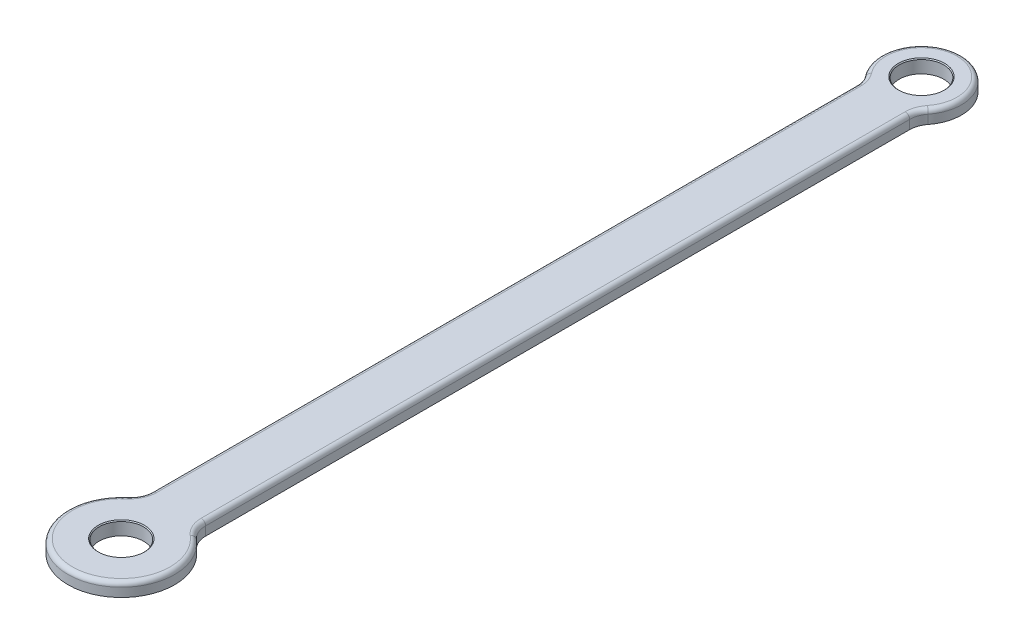
ISO-10303-21;
HEADER;
FILE_DESCRIPTION(('STEP AP214'),'2;1');
FILE_NAME('part.step','',(''),(''),'','','');
FILE_SCHEMA(('AUTOMOTIVE_DESIGN { 1 0 10303 214 1 1 1 1 }'));
ENDSEC;
DATA;
#1=APPLICATION_CONTEXT('core data for automotive mechanical design processes');
#2=APPLICATION_PROTOCOL_DEFINITION('international standard','automotive_design',2000,#1);
#3=PRODUCT_CONTEXT('',#1,'mechanical');
#4=PRODUCT('Part','Part','',(#3));
#5=PRODUCT_RELATED_PRODUCT_CATEGORY('part','',(#4));
#6=PRODUCT_DEFINITION_FORMATION('','',#4);
#7=PRODUCT_DEFINITION_CONTEXT('part definition',#1,'design');
#8=PRODUCT_DEFINITION('design','',#6,#7);
#9=PRODUCT_DEFINITION_SHAPE('','',#8);
#10=(LENGTH_UNIT() NAMED_UNIT(*) SI_UNIT(.MILLI.,.METRE.));
#11=(NAMED_UNIT(*) PLANE_ANGLE_UNIT() SI_UNIT($,.RADIAN.));
#12=(NAMED_UNIT(*) SI_UNIT($,.STERADIAN.) SOLID_ANGLE_UNIT());
#13=UNCERTAINTY_MEASURE_WITH_UNIT(LENGTH_MEASURE(1.E-05),#10,'distance_accuracy_value','');
#14=(GEOMETRIC_REPRESENTATION_CONTEXT(3) GLOBAL_UNCERTAINTY_ASSIGNED_CONTEXT((#13)) GLOBAL_UNIT_ASSIGNED_CONTEXT((#10,
#11,#12)) REPRESENTATION_CONTEXT('',''));
#15=CARTESIAN_POINT('',(0.,0.,0.));
#16=DIRECTION('',(0.,0.,1.));
#17=DIRECTION('',(1.,0.,0.));
#18=AXIS2_PLACEMENT_3D('',#15,#16,#17);
#19=CARTESIAN_POINT('',(0.,2.5,-31.9864213350138));
#20=DIRECTION('',(0.,1.,0.));
#21=DIRECTION('',(0.,0.,1.));
#22=AXIS2_PLACEMENT_3D('',#19,#20,#21);
#23=PLANE('',#22);
#24=CARTESIAN_POINT('',(0.,2.5,-31.9864213350138));
#25=DIRECTION('',(0.,1.,0.));
#26=DIRECTION('',(0.,0.,1.));
#27=AXIS2_PLACEMENT_3D('',#24,#25,#26);
#28=CIRCLE('',#27,8.);
#29=CARTESIAN_POINT('',(6.28571428571429,2.5,-27.0377047419598));
#30=VERTEX_POINT('',#29);
#31=CARTESIAN_POINT('',(-6.28571428571429,2.5,-27.0377047419598));
#32=VERTEX_POINT('',#31);
#33=EDGE_CURVE('E212',#30,#32,#28,.T.);
#34=ORIENTED_EDGE('',*,*,#33,.T.);
#35=CARTESIAN_POINT('',(-11.,2.5,-23.3261672971694));
#36=DIRECTION('',(0.,1.,0.));
#37=DIRECTION('',(0.,0.,1.));
#38=AXIS2_PLACEMENT_3D('',#35,#36,#37);
#39=CIRCLE('',#38,6.);
#40=CARTESIAN_POINT('',(-5.,2.5,-23.3261672971694));
#41=VERTEX_POINT('',#40);
#42=EDGE_CURVE('E214',#32,#41,#39,.F.);
#43=ORIENTED_EDGE('',*,*,#42,.T.);
#44=DIRECTION('',(0.,0.,1.));
#45=VECTOR('',#44,1.);
#46=CARTESIAN_POINT('',(-5.00000000000002,2.5,135.052097268171));
#47=LINE('',#46,#45);
#48=CARTESIAN_POINT('',(-5.00000000000002,2.5,135.052097268171));
#49=VERTEX_POINT('',#48);
#50=EDGE_CURVE('E200',#41,#49,#47,.T.);
#51=ORIENTED_EDGE('',*,*,#50,.T.);
#52=CARTESIAN_POINT('',(-11.,2.5,135.052097268171));
#53=DIRECTION('',(0.,1.,0.));
#54=DIRECTION('',(0.,0.,1.));
#55=AXIS2_PLACEMENT_3D('',#52,#53,#54);
#56=CIRCLE('',#55,6.);
#57=CARTESIAN_POINT('',(-7.11764705882354,2.5,139.626737761164));
#58=VERTEX_POINT('',#57);
#59=EDGE_CURVE('E202',#49,#58,#56,.F.);
#60=ORIENTED_EDGE('',*,*,#59,.T.);
#61=CARTESIAN_POINT('',(0.,2.5,148.013578664986));
#62=DIRECTION('',(0.,1.,0.));
#63=DIRECTION('',(0.,0.,1.));
#64=AXIS2_PLACEMENT_3D('',#61,#62,#63);
#65=CIRCLE('',#64,11.);
#66=CARTESIAN_POINT('',(7.11764705882354,2.5,139.626737761164));
#67=VERTEX_POINT('',#66);
#68=EDGE_CURVE('E204',#58,#67,#65,.T.);
#69=ORIENTED_EDGE('',*,*,#68,.T.);
#70=CARTESIAN_POINT('',(11.,2.5,135.052097268171));
#71=DIRECTION('',(0.,1.,0.));
#72=DIRECTION('',(0.,0.,1.));
#73=AXIS2_PLACEMENT_3D('',#70,#71,#72);
#74=CIRCLE('',#73,6.);
#75=CARTESIAN_POINT('',(5.00000000000002,2.5,135.052097268171));
#76=VERTEX_POINT('',#75);
#77=EDGE_CURVE('E206',#67,#76,#74,.F.);
#78=ORIENTED_EDGE('',*,*,#77,.T.);
#79=DIRECTION('',(0.,0.,-1.));
#80=VECTOR('',#79,1.);
#81=CARTESIAN_POINT('',(5.,2.5,-23.3261672971694));
#82=LINE('',#81,#80);
#83=CARTESIAN_POINT('',(5.,2.5,-23.3261672971694));
#84=VERTEX_POINT('',#83);
#85=EDGE_CURVE('E208',#76,#84,#82,.T.);
#86=ORIENTED_EDGE('',*,*,#85,.T.);
#87=CARTESIAN_POINT('',(11.,2.5,-23.3261672971694));
#88=DIRECTION('',(0.,1.,0.));
#89=DIRECTION('',(0.,0.,1.));
#90=AXIS2_PLACEMENT_3D('',#87,#88,#89);
#91=CIRCLE('',#90,6.);
#92=EDGE_CURVE('E210',#84,#30,#91,.F.);
#93=ORIENTED_EDGE('',*,*,#92,.T.);
#94=EDGE_LOOP('',(#34,#43,#51,#60,#69,#78,#86,#93));
#95=FACE_BOUND('',#94,.T.);
#96=CARTESIAN_POINT('',(0.,2.5,148.013578664986));
#97=DIRECTION('',(0.,1.,0.));
#98=DIRECTION('',(0.,0.,1.));
#99=AXIS2_PLACEMENT_3D('',#96,#97,#98);
#100=CIRCLE('',#99,5.20000000000001);
#101=CARTESIAN_POINT('',(0.,2.5,153.213578664986));
#102=VERTEX_POINT('',#101);
#103=EDGE_CURVE('E179',#102,#102,#100,.F.);
#104=ORIENTED_EDGE('',*,*,#103,.T.);
#105=EDGE_LOOP('',(#104));
#106=FACE_BOUND('',#105,.T.);
#107=CARTESIAN_POINT('',(0.,2.5,-31.9864213350138));
#108=DIRECTION('',(0.,1.,0.));
#109=DIRECTION('',(0.,0.,1.));
#110=AXIS2_PLACEMENT_3D('',#107,#108,#109);
#111=CIRCLE('',#110,5.20000000000001);
#112=CARTESIAN_POINT('',(0.,2.5,-26.7864213350137));
#113=VERTEX_POINT('',#112);
#114=EDGE_CURVE('E171',#113,#113,#111,.F.);
#115=ORIENTED_EDGE('',*,*,#114,.T.);
#116=EDGE_LOOP('',(#115));
#117=FACE_BOUND('',#116,.T.);
#118=ADVANCED_FACE('F47',(#95,#106,#117),#23,.T.);
#119=CARTESIAN_POINT('',(0.,-0.5,-31.9864213350138));
#120=DIRECTION('',(0.,1.,0.));
#121=DIRECTION('',(0.,0.,1.));
#122=AXIS2_PLACEMENT_3D('',#119,#120,#121);
#123=PLANE('',#122);
#124=CARTESIAN_POINT('',(0.,-0.5,-31.9864213350138));
#125=DIRECTION('',(0.,1.,0.));
#126=DIRECTION('',(0.,0.,1.));
#127=AXIS2_PLACEMENT_3D('',#124,#125,#126);
#128=CIRCLE('',#127,9.);
#129=CARTESIAN_POINT('',(7.07142857142857,-0.5,-26.4191151678281));
#130=VERTEX_POINT('',#129);
#131=CARTESIAN_POINT('',(-7.07142857142857,-0.5,-26.4191151678281));
#132=VERTEX_POINT('',#131);
#133=EDGE_CURVE('E260',#130,#132,#128,.T.);
#134=ORIENTED_EDGE('',*,*,#133,.F.);
#135=CARTESIAN_POINT('',(11.,-0.5,-23.3261672971694));
#136=DIRECTION('',(0.,1.,0.));
#137=DIRECTION('',(0.,0.,1.));
#138=AXIS2_PLACEMENT_3D('',#135,#136,#137);
#139=CIRCLE('',#138,5.);
#140=CARTESIAN_POINT('',(6.,-0.5,-23.3261672971694));
#141=VERTEX_POINT('',#140);
#142=EDGE_CURVE('E166',#130,#141,#139,.T.);
#143=ORIENTED_EDGE('',*,*,#142,.T.);
#144=DIRECTION('',(0.,0.,-1.));
#145=VECTOR('',#144,1.);
#146=CARTESIAN_POINT('',(6.,-0.5,-25.2782174025144));
#147=LINE('',#146,#145);
#148=CARTESIAN_POINT('',(6.00000000000002,-0.5,135.052097268171));
#149=VERTEX_POINT('',#148);
#150=EDGE_CURVE('E143',#149,#141,#147,.T.);
#151=ORIENTED_EDGE('',*,*,#150,.F.);
#152=CARTESIAN_POINT('',(11.,-0.5,135.052097268171));
#153=DIRECTION('',(0.,1.,0.));
#154=DIRECTION('',(0.,0.,1.));
#155=AXIS2_PLACEMENT_3D('',#152,#153,#154);
#156=CIRCLE('',#155,5.);
#157=CARTESIAN_POINT('',(7.76470588235296,-0.5,138.864297678999));
#158=VERTEX_POINT('',#157);
#159=EDGE_CURVE('E153',#149,#158,#156,.T.);
#160=ORIENTED_EDGE('',*,*,#159,.T.);
#161=CARTESIAN_POINT('',(0.,-0.5,148.013578664986));
#162=DIRECTION('',(0.,1.,0.));
#163=DIRECTION('',(0.,0.,1.));
#164=AXIS2_PLACEMENT_3D('',#161,#162,#163);
#165=CIRCLE('',#164,12.);
#166=CARTESIAN_POINT('',(-7.76470588235296,-0.5,138.864297678999));
#167=VERTEX_POINT('',#166);
#168=EDGE_CURVE('E168',#167,#158,#165,.T.);
#169=ORIENTED_EDGE('',*,*,#168,.F.);
#170=CARTESIAN_POINT('',(-11.,-0.5,135.052097268171));
#171=DIRECTION('',(0.,1.,0.));
#172=DIRECTION('',(0.,0.,1.));
#173=AXIS2_PLACEMENT_3D('',#170,#171,#172);
#174=CIRCLE('',#173,5.);
#175=CARTESIAN_POINT('',(-6.00000000000002,-0.5,135.052097268171));
#176=VERTEX_POINT('',#175);
#177=EDGE_CURVE('E159',#167,#176,#174,.T.);
#178=ORIENTED_EDGE('',*,*,#177,.T.);
#179=DIRECTION('',(0.,0.,1.));
#180=VECTOR('',#179,1.);
#181=CARTESIAN_POINT('',(-6.,-0.5,-25.2782174025144));
#182=LINE('',#181,#180);
#183=CARTESIAN_POINT('',(-6.,-0.5,-23.3261672971694));
#184=VERTEX_POINT('',#183);
#185=EDGE_CURVE('E173',#184,#176,#182,.T.);
#186=ORIENTED_EDGE('',*,*,#185,.F.);
#187=CARTESIAN_POINT('',(-11.,-0.5,-23.3261672971694));
#188=DIRECTION('',(0.,1.,0.));
#189=DIRECTION('',(0.,0.,1.));
#190=AXIS2_PLACEMENT_3D('',#187,#188,#189);
#191=CIRCLE('',#190,5.);
#192=EDGE_CURVE('E197',#184,#132,#191,.T.);
#193=ORIENTED_EDGE('',*,*,#192,.T.);
#194=EDGE_LOOP('',(#134,#143,#151,#160,#169,#178,#186,#193));
#195=FACE_BOUND('',#194,.T.);
#196=CARTESIAN_POINT('',(0.,-0.5,-31.9864213350138));
#197=DIRECTION('',(0.,1.,0.));
#198=DIRECTION('',(0.,0.,1.));
#199=AXIS2_PLACEMENT_3D('',#196,#197,#198);
#200=CIRCLE('',#199,5.);
#201=CARTESIAN_POINT('',(0.,-0.5,-26.9864213350138));
#202=VERTEX_POINT('',#201);
#203=EDGE_CURVE('E255',#202,#202,#200,.T.);
#204=ORIENTED_EDGE('',*,*,#203,.T.);
#205=EDGE_LOOP('',(#204));
#206=FACE_BOUND('',#205,.T.);
#207=CARTESIAN_POINT('',(0.,-0.5,148.013578664986));
#208=DIRECTION('',(0.,1.,0.));
#209=DIRECTION('',(0.,0.,1.));
#210=AXIS2_PLACEMENT_3D('',#207,#208,#209);
#211=CIRCLE('',#210,5.);
#212=CARTESIAN_POINT('',(0.,-0.5,153.013578664986));
#213=VERTEX_POINT('',#212);
#214=EDGE_CURVE('E250',#213,#213,#211,.T.);
#215=ORIENTED_EDGE('',*,*,#214,.T.);
#216=EDGE_LOOP('',(#215));
#217=FACE_BOUND('',#216,.T.);
#218=ADVANCED_FACE('F163',(#195,#206,#217),#123,.F.);
#219=CARTESIAN_POINT('',(0.,2.5,-31.9864213350138));
#220=DIRECTION('',(0.,-1.,0.));
#221=DIRECTION('',(0.,0.,-1.));
#222=AXIS2_PLACEMENT_3D('',#219,#220,#221);
#223=CYLINDRICAL_SURFACE('',#222,9.);
#224=DIRECTION('',(0.,-1.,0.));
#225=VECTOR('',#224,1.);
#226=CARTESIAN_POINT('',(-7.07142857142857,2.5,-26.4191151678281));
#227=LINE('',#226,#225);
#228=CARTESIAN_POINT('',(-7.07142857142857,1.5,-26.4191151678281));
#229=VERTEX_POINT('',#228);
#230=EDGE_CURVE('E160',#132,#229,#227,.F.);
#231=ORIENTED_EDGE('',*,*,#230,.T.);
#232=CARTESIAN_POINT('',(0.,1.5,-31.9864213350138));
#233=DIRECTION('',(0.,1.,0.));
#234=DIRECTION('',(0.,0.,1.));
#235=AXIS2_PLACEMENT_3D('',#232,#233,#234);
#236=CIRCLE('',#235,9.);
#237=CARTESIAN_POINT('',(7.07142857142857,1.5,-26.4191151678281));
#238=VERTEX_POINT('',#237);
#239=EDGE_CURVE('E220',#229,#238,#236,.F.);
#240=ORIENTED_EDGE('',*,*,#239,.T.);
#241=DIRECTION('',(0.,-1.,0.));
#242=VECTOR('',#241,1.);
#243=CARTESIAN_POINT('',(7.07142857142857,2.5,-26.4191151678281));
#244=LINE('',#243,#242);
#245=EDGE_CURVE('E192',#238,#130,#244,.T.);
#246=ORIENTED_EDGE('',*,*,#245,.T.);
#247=ORIENTED_EDGE('',*,*,#133,.T.);
#248=EDGE_LOOP('',(#231,#240,#246,#247));
#249=FACE_BOUND('',#248,.T.);
#250=ADVANCED_FACE('F301',(#249),#223,.T.);
#251=CARTESIAN_POINT('',(-6.,2.5,-25.2782174025144));
#252=DIRECTION('',(1.,0.,0.));
#253=DIRECTION('',(0.,0.,-1.));
#254=AXIS2_PLACEMENT_3D('',#251,#252,#253);
#255=PLANE('',#254);
#256=DIRECTION('',(0.,1.,0.));
#257=VECTOR('',#256,1.);
#258=CARTESIAN_POINT('',(-6.00000000000002,2.5,135.052097268171));
#259=LINE('',#258,#257);
#260=CARTESIAN_POINT('',(-6.00000000000002,1.5,135.052097268171));
#261=VERTEX_POINT('',#260);
#262=EDGE_CURVE('E190',#176,#261,#259,.T.);
#263=ORIENTED_EDGE('',*,*,#262,.T.);
#264=DIRECTION('',(0.,0.,1.));
#265=VECTOR('',#264,1.);
#266=CARTESIAN_POINT('',(-6.,1.5,-23.3261672971694));
#267=LINE('',#266,#265);
#268=CARTESIAN_POINT('',(-6.,1.5,-23.3261672971694));
#269=VERTEX_POINT('',#268);
#270=EDGE_CURVE('E12',#261,#269,#267,.F.);
#271=ORIENTED_EDGE('',*,*,#270,.T.);
#272=DIRECTION('',(0.,1.,0.));
#273=VECTOR('',#272,1.);
#274=CARTESIAN_POINT('',(-6.,-0.5,-23.3261672971694));
#275=LINE('',#274,#273);
#276=EDGE_CURVE('E188',#269,#184,#275,.F.);
#277=ORIENTED_EDGE('',*,*,#276,.T.);
#278=ORIENTED_EDGE('',*,*,#185,.T.);
#279=EDGE_LOOP('',(#263,#271,#277,#278));
#280=FACE_BOUND('',#279,.T.);
#281=ADVANCED_FACE('F267',(#280),#255,.F.);
#282=CARTESIAN_POINT('',(0.,2.5,148.013578664986));
#283=DIRECTION('',(0.,-1.,0.));
#284=DIRECTION('',(0.,0.,-1.));
#285=AXIS2_PLACEMENT_3D('',#282,#283,#284);
#286=CYLINDRICAL_SURFACE('',#285,12.);
#287=DIRECTION('',(0.,-1.,0.));
#288=VECTOR('',#287,1.);
#289=CARTESIAN_POINT('',(7.76470588235296,2.5,138.864297678999));
#290=LINE('',#289,#288);
#291=CARTESIAN_POINT('',(7.76470588235296,1.5,138.864297678999));
#292=VERTEX_POINT('',#291);
#293=EDGE_CURVE('E155',#158,#292,#290,.F.);
#294=ORIENTED_EDGE('',*,*,#293,.T.);
#295=CARTESIAN_POINT('',(0.,1.5,148.013578664986));
#296=DIRECTION('',(0.,1.,0.));
#297=DIRECTION('',(0.,0.,1.));
#298=AXIS2_PLACEMENT_3D('',#295,#296,#297);
#299=CIRCLE('',#298,12.);
#300=CARTESIAN_POINT('',(-7.76470588235296,1.5,138.864297678999));
#301=VERTEX_POINT('',#300);
#302=EDGE_CURVE('E71',#292,#301,#299,.F.);
#303=ORIENTED_EDGE('',*,*,#302,.T.);
#304=DIRECTION('',(0.,-1.,0.));
#305=VECTOR('',#304,1.);
#306=CARTESIAN_POINT('',(-7.76470588235296,2.5,138.864297678999));
#307=LINE('',#306,#305);
#308=EDGE_CURVE('E149',#301,#167,#307,.T.);
#309=ORIENTED_EDGE('',*,*,#308,.T.);
#310=ORIENTED_EDGE('',*,*,#168,.T.);
#311=EDGE_LOOP('',(#294,#303,#309,#310));
#312=FACE_BOUND('',#311,.T.);
#313=ADVANCED_FACE('F274',(#312),#286,.T.);
#314=CARTESIAN_POINT('',(6.,2.5,-25.2782174025144));
#315=DIRECTION('',(-1.,0.,0.));
#316=DIRECTION('',(0.,0.,1.));
#317=AXIS2_PLACEMENT_3D('',#314,#315,#316);
#318=PLANE('',#317);
#319=DIRECTION('',(0.,1.,0.));
#320=VECTOR('',#319,1.);
#321=CARTESIAN_POINT('',(6.,2.5,-23.3261672971694));
#322=LINE('',#321,#320);
#323=CARTESIAN_POINT('',(6.,1.5,-23.3261672971694));
#324=VERTEX_POINT('',#323);
#325=EDGE_CURVE('E150',#141,#324,#322,.T.);
#326=ORIENTED_EDGE('',*,*,#325,.T.);
#327=DIRECTION('',(0.,0.,-1.));
#328=VECTOR('',#327,1.);
#329=CARTESIAN_POINT('',(6.00000000000002,1.5,135.052097268171));
#330=LINE('',#329,#328);
#331=CARTESIAN_POINT('',(6.00000000000002,1.5,135.052097268171));
#332=VERTEX_POINT('',#331);
#333=EDGE_CURVE('E146',#324,#332,#330,.F.);
#334=ORIENTED_EDGE('',*,*,#333,.T.);
#335=DIRECTION('',(0.,1.,0.));
#336=VECTOR('',#335,1.);
#337=CARTESIAN_POINT('',(6.00000000000002,-0.5,135.052097268171));
#338=LINE('',#337,#336);
#339=EDGE_CURVE('E138',#332,#149,#338,.F.);
#340=ORIENTED_EDGE('',*,*,#339,.T.);
#341=ORIENTED_EDGE('',*,*,#150,.T.);
#342=EDGE_LOOP('',(#326,#334,#340,#341));
#343=FACE_BOUND('',#342,.T.);
#344=ADVANCED_FACE('F141',(#343),#318,.F.);
#345=CARTESIAN_POINT('',(0.,2.5,-31.9864213350138));
#346=DIRECTION('',(0.,-1.,0.));
#347=DIRECTION('',(0.,0.,-1.));
#348=AXIS2_PLACEMENT_3D('',#345,#346,#347);
#349=CYLINDRICAL_SURFACE('',#348,5.);
#350=CARTESIAN_POINT('',(0.,2.29999999999999,-31.9864213350138));
#351=DIRECTION('',(0.,1.,0.));
#352=DIRECTION('',(0.,0.,1.));
#353=AXIS2_PLACEMENT_3D('',#350,#351,#352);
#354=CIRCLE('',#353,5.);
#355=CARTESIAN_POINT('',(0.,2.29999999999999,-26.9864213350138));
#356=VERTEX_POINT('',#355);
#357=EDGE_CURVE('E182',#356,#356,#354,.T.);
#358=ORIENTED_EDGE('',*,*,#357,.T.);
#359=EDGE_LOOP('',(#358));
#360=FACE_BOUND('',#359,.T.);
#361=ORIENTED_EDGE('',*,*,#203,.F.);
#362=EDGE_LOOP('',(#361));
#363=FACE_BOUND('',#362,.T.);
#364=ADVANCED_FACE('F325',(#360,#363),#349,.F.);
#365=CARTESIAN_POINT('',(0.,2.5,148.013578664986));
#366=DIRECTION('',(0.,-1.,0.));
#367=DIRECTION('',(0.,0.,-1.));
#368=AXIS2_PLACEMENT_3D('',#365,#366,#367);
#369=CYLINDRICAL_SURFACE('',#368,5.);
#370=CARTESIAN_POINT('',(0.,2.29999999999999,148.013578664986));
#371=DIRECTION('',(0.,1.,0.));
#372=DIRECTION('',(0.,0.,1.));
#373=AXIS2_PLACEMENT_3D('',#370,#371,#372);
#374=CIRCLE('',#373,5.);
#375=CARTESIAN_POINT('',(0.,2.29999999999999,153.013578664986));
#376=VERTEX_POINT('',#375);
#377=EDGE_CURVE('E167',#376,#376,#374,.T.);
#378=ORIENTED_EDGE('',*,*,#377,.T.);
#379=EDGE_LOOP('',(#378));
#380=FACE_BOUND('',#379,.T.);
#381=ORIENTED_EDGE('',*,*,#214,.F.);
#382=EDGE_LOOP('',(#381));
#383=FACE_BOUND('',#382,.T.);
#384=ADVANCED_FACE('F328',(#380,#383),#369,.F.);
#385=CARTESIAN_POINT('',(0.,2.29999999999999,148.013578664986));
#386=DIRECTION('',(0.,1.,0.));
#387=DIRECTION('',(0.,0.,1.));
#388=AXIS2_PLACEMENT_3D('',#385,#386,#387);
#389=CONICAL_SURFACE('',#388,5.,0.78539816339745);
#390=CARTESIAN_POINT('',(0.,2.5,153.213578664986));
#391=CARTESIAN_POINT('',(0.,2.49791666666667,153.211495331653));
#392=CARTESIAN_POINT('',(0.,2.49583333333334,153.20941199832));
#393=CARTESIAN_POINT('',(0.,2.49166666666667,153.205245331653));
#394=CARTESIAN_POINT('',(0.,2.48958333333333,153.20316199832));
#395=CARTESIAN_POINT('',(0.,2.48541666666666,153.198995331653));
#396=CARTESIAN_POINT('',(0.,2.48333333333333,153.19691199832));
#397=CARTESIAN_POINT('',(0.,2.47916666666667,153.192745331653));
#398=CARTESIAN_POINT('',(0.,2.47708333333333,153.19066199832));
#399=CARTESIAN_POINT('',(0.,2.47291666666666,153.186495331653));
#400=CARTESIAN_POINT('',(0.,2.47083333333333,153.18441199832));
#401=CARTESIAN_POINT('',(0.,2.46666666666667,153.180245331653));
#402=CARTESIAN_POINT('',(0.,2.46458333333333,153.17816199832));
#403=CARTESIAN_POINT('',(0.,2.46041666666666,153.173995331653));
#404=CARTESIAN_POINT('',(0.,2.45833333333333,153.17191199832));
#405=CARTESIAN_POINT('',(0.,2.45416666666667,153.167745331653));
#406=CARTESIAN_POINT('',(0.,2.45208333333333,153.16566199832));
#407=CARTESIAN_POINT('',(0.,2.44791666666666,153.161495331653));
#408=CARTESIAN_POINT('',(0.,2.44583333333333,153.15941199832));
#409=CARTESIAN_POINT('',(0.,2.44166666666667,153.155245331653));
#410=CARTESIAN_POINT('',(0.,2.43958333333333,153.15316199832));
#411=CARTESIAN_POINT('',(0.,2.43541666666666,153.148995331653));
#412=CARTESIAN_POINT('',(0.,2.43333333333333,153.14691199832));
#413=CARTESIAN_POINT('',(0.,2.42916666666666,153.142745331653));
#414=CARTESIAN_POINT('',(0.,2.42708333333333,153.14066199832));
#415=CARTESIAN_POINT('',(0.,2.42291666666666,153.136495331653));
#416=CARTESIAN_POINT('',(0.,2.42083333333333,153.13441199832));
#417=CARTESIAN_POINT('',(0.,2.41666666666666,153.130245331653));
#418=CARTESIAN_POINT('',(0.,2.41458333333333,153.12816199832));
#419=CARTESIAN_POINT('',(0.,2.41041666666666,153.123995331653));
#420=CARTESIAN_POINT('',(0.,2.40833333333333,153.12191199832));
#421=CARTESIAN_POINT('',(0.,2.40416666666666,153.117745331653));
#422=CARTESIAN_POINT('',(0.,2.40208333333333,153.11566199832));
#423=CARTESIAN_POINT('',(0.,2.39791666666666,153.111495331653));
#424=CARTESIAN_POINT('',(0.,2.39583333333333,153.10941199832));
#425=CARTESIAN_POINT('',(0.,2.39166666666666,153.105245331653));
#426=CARTESIAN_POINT('',(0.,2.38958333333333,153.10316199832));
#427=CARTESIAN_POINT('',(0.,2.38541666666666,153.098995331653));
#428=CARTESIAN_POINT('',(0.,2.38333333333332,153.09691199832));
#429=CARTESIAN_POINT('',(0.,2.37916666666666,153.092745331653));
#430=CARTESIAN_POINT('',(0.,2.37708333333333,153.09066199832));
#431=CARTESIAN_POINT('',(0.,2.37291666666666,153.086495331653));
#432=CARTESIAN_POINT('',(0.,2.37083333333332,153.08441199832));
#433=CARTESIAN_POINT('',(0.,2.36666666666666,153.080245331653));
#434=CARTESIAN_POINT('',(0.,2.36458333333333,153.07816199832));
#435=CARTESIAN_POINT('',(0.,2.36041666666666,153.073995331653));
#436=CARTESIAN_POINT('',(0.,2.35833333333332,153.07191199832));
#437=CARTESIAN_POINT('',(0.,2.35416666666666,153.067745331653));
#438=CARTESIAN_POINT('',(0.,2.35208333333333,153.06566199832));
#439=CARTESIAN_POINT('',(0.,2.34791666666666,153.061495331653));
#440=CARTESIAN_POINT('',(0.,2.34583333333332,153.05941199832));
#441=CARTESIAN_POINT('',(0.,2.34166666666665,153.055245331653));
#442=CARTESIAN_POINT('',(0.,2.33958333333332,153.05316199832));
#443=CARTESIAN_POINT('',(0.,2.33541666666666,153.048995331653));
#444=CARTESIAN_POINT('',(0.,2.33333333333333,153.04691199832));
#445=CARTESIAN_POINT('',(0.,2.32916666666666,153.042745331653));
#446=CARTESIAN_POINT('',(0.,2.32708333333332,153.04066199832));
#447=CARTESIAN_POINT('',(0.,2.32291666666665,153.036495331653));
#448=CARTESIAN_POINT('',(0.,2.32083333333333,153.03441199832));
#449=CARTESIAN_POINT('',(0.,2.31666666666666,153.030245331653));
#450=CARTESIAN_POINT('',(0.,2.31458333333332,153.02816199832));
#451=CARTESIAN_POINT('',(0.,2.31041666666665,153.023995331653));
#452=CARTESIAN_POINT('',(0.,2.30833333333332,153.02191199832));
#453=CARTESIAN_POINT('',(0.,2.30416666666666,153.017745331653));
#454=CARTESIAN_POINT('',(0.,2.30208333333333,153.01566199832));
#455=CARTESIAN_POINT('',(0.,2.29999999999999,153.013578664986));
#456=B_SPLINE_CURVE_WITH_KNOTS('',3,(#390,#391,#392,#393,#394,#395,#396,#397,#398,#399,#400,
#401,#402,#403,#404,#405,#406,#407,#408,#409,#410,#411,#412,#413,#414,#415,#416,#417,#418,#419,
#420,#421,#422,#423,#424,#425,#426,#427,#428,#429,#430,#431,#432,#433,#434,#435,#436,#437,#438,
#439,#440,#441,#442,#443,#444,#445,#446,#447,#448,#449,#450,#451,#452,#453,#454,#455),
.UNSPECIFIED.,.F.,.F.,(4,2,2,2,2,2,2,2,2,2,2,2,2,2,2,2,2,2,2,2,2,2,2,2,2,2,2,2,2,2,2,2,4),(0.,
0.0088388347648413,0.017677669529663,0.0265165042945046,0.0353553390593262,0.0441941738241675,
0.0530330085889892,0.0618718433538308,0.0707106781186525,0.0795495128834938,0.0883883476483158,
0.0972271824131571,0.106066017177979,0.11490485194282,0.123743686707662,0.132582521472483,
0.141421356237325,0.150260191002147,0.159099025766988,0.16793786053181,0.176776695296651,
0.185615530061473,0.194454364826314,0.203293199591136,0.212132034355977,0.220970869120799,
0.229809703885641,0.238648538650482,0.247487373415304,0.256326208180145,0.265165042944967,
0.274003877709808,0.28284271247463),.UNSPECIFIED.);
#457=EDGE_CURVE('BSEAM321',#102,#376,#456,.T.);
#458=ORIENTED_EDGE('',*,*,#103,.F.);
#459=ORIENTED_EDGE('',*,*,#377,.F.);
#460=ORIENTED_EDGE('',*,*,#457,.T.);
#461=ORIENTED_EDGE('',*,*,#457,.F.);
#462=EDGE_LOOP('',(#458,#460,#459,#461));
#463=FACE_BOUND('',#462,.T.);
#464=ADVANCED_FACE('F321',(#463),#389,.F.);
#465=CARTESIAN_POINT('',(0.,2.29999999999999,-31.9864213350138));
#466=DIRECTION('',(0.,1.,0.));
#467=DIRECTION('',(0.,0.,1.));
#468=AXIS2_PLACEMENT_3D('',#465,#466,#467);
#469=CONICAL_SURFACE('',#468,5.,0.78539816339745);
#470=ORIENTED_EDGE('',*,*,#114,.F.);
#471=EDGE_LOOP('',(#470));
#472=FACE_BOUND('',#471,.T.);
#473=ORIENTED_EDGE('',*,*,#357,.F.);
#474=EDGE_LOOP('',(#473));
#475=FACE_BOUND('',#474,.T.);
#476=ADVANCED_FACE('F318',(#472,#475),#469,.F.);
#477=CARTESIAN_POINT('',(11.,2.5,135.052097268171));
#478=DIRECTION('',(0.,-1.,0.));
#479=DIRECTION('',(0.,0.,-1.));
#480=AXIS2_PLACEMENT_3D('',#477,#478,#479);
#481=CYLINDRICAL_SURFACE('',#480,5.);
#482=ORIENTED_EDGE('',*,*,#339,.F.);
#483=CARTESIAN_POINT('',(11.,1.5,135.052097268171));
#484=DIRECTION('',(0.,1.,0.));
#485=DIRECTION('',(0.,0.,1.));
#486=AXIS2_PLACEMENT_3D('',#483,#484,#485);
#487=CIRCLE('',#486,5.);
#488=EDGE_CURVE('E225',#332,#292,#487,.T.);
#489=ORIENTED_EDGE('',*,*,#488,.T.);
#490=ORIENTED_EDGE('',*,*,#293,.F.);
#491=ORIENTED_EDGE('',*,*,#159,.F.);
#492=EDGE_LOOP('',(#482,#489,#490,#491));
#493=FACE_BOUND('',#492,.T.);
#494=ADVANCED_FACE('F154',(#493),#481,.F.);
#495=CARTESIAN_POINT('',(-11.,2.5,135.052097268171));
#496=DIRECTION('',(0.,-1.,0.));
#497=DIRECTION('',(0.,0.,-1.));
#498=AXIS2_PLACEMENT_3D('',#495,#496,#497);
#499=CYLINDRICAL_SURFACE('',#498,5.);
#500=ORIENTED_EDGE('',*,*,#308,.F.);
#501=CARTESIAN_POINT('',(-11.,1.5,135.052097268171));
#502=DIRECTION('',(0.,1.,0.));
#503=DIRECTION('',(0.,0.,1.));
#504=AXIS2_PLACEMENT_3D('',#501,#502,#503);
#505=CIRCLE('',#504,5.);
#506=EDGE_CURVE('E56',#301,#261,#505,.T.);
#507=ORIENTED_EDGE('',*,*,#506,.T.);
#508=ORIENTED_EDGE('',*,*,#262,.F.);
#509=ORIENTED_EDGE('',*,*,#177,.F.);
#510=EDGE_LOOP('',(#500,#507,#508,#509));
#511=FACE_BOUND('',#510,.T.);
#512=ADVANCED_FACE('F272',(#511),#499,.F.);
#513=CARTESIAN_POINT('',(-11.,2.5,-23.3261672971694));
#514=DIRECTION('',(0.,-1.,0.));
#515=DIRECTION('',(0.,0.,-1.));
#516=AXIS2_PLACEMENT_3D('',#513,#514,#515);
#517=CYLINDRICAL_SURFACE('',#516,5.);
#518=ORIENTED_EDGE('',*,*,#276,.F.);
#519=CARTESIAN_POINT('',(-11.,1.5,-23.3261672971694));
#520=DIRECTION('',(0.,1.,0.));
#521=DIRECTION('',(0.,0.,1.));
#522=AXIS2_PLACEMENT_3D('',#519,#520,#521);
#523=CIRCLE('',#522,5.);
#524=EDGE_CURVE('E217',#269,#229,#523,.T.);
#525=ORIENTED_EDGE('',*,*,#524,.T.);
#526=ORIENTED_EDGE('',*,*,#230,.F.);
#527=ORIENTED_EDGE('',*,*,#192,.F.);
#528=EDGE_LOOP('',(#518,#525,#526,#527));
#529=FACE_BOUND('',#528,.T.);
#530=ADVANCED_FACE('F288',(#529),#517,.F.);
#531=CARTESIAN_POINT('',(11.,2.5,-23.3261672971694));
#532=DIRECTION('',(0.,-1.,0.));
#533=DIRECTION('',(0.,0.,-1.));
#534=AXIS2_PLACEMENT_3D('',#531,#532,#533);
#535=CYLINDRICAL_SURFACE('',#534,5.);
#536=ORIENTED_EDGE('',*,*,#245,.F.);
#537=CARTESIAN_POINT('',(11.,1.5,-23.3261672971694));
#538=DIRECTION('',(0.,1.,0.));
#539=DIRECTION('',(0.,0.,1.));
#540=AXIS2_PLACEMENT_3D('',#537,#538,#539);
#541=CIRCLE('',#540,5.);
#542=EDGE_CURVE('E222',#238,#324,#541,.T.);
#543=ORIENTED_EDGE('',*,*,#542,.T.);
#544=ORIENTED_EDGE('',*,*,#325,.F.);
#545=ORIENTED_EDGE('',*,*,#142,.F.);
#546=EDGE_LOOP('',(#536,#543,#544,#545));
#547=FACE_BOUND('',#546,.T.);
#548=ADVANCED_FACE('F304',(#547),#535,.F.);
#549=CARTESIAN_POINT('',(11.,1.5,135.052097268171));
#550=DIRECTION('',(0.,1.,0.));
#551=DIRECTION('',(0.,0.,1.));
#552=AXIS2_PLACEMENT_3D('',#549,#550,#551);
#553=TOROIDAL_SURFACE('',#552,6.,1.);
#554=CARTESIAN_POINT('',(7.11764705882353,1.5,139.626737761164));
#555=DIRECTION('',(0.762440082165632,0.,0.647058823529409));
#556=DIRECTION('',(0.64705882352941,0.,-0.762440082165633));
#557=AXIS2_PLACEMENT_3D('',#554,#555,#556);
#558=CIRCLE('',#557,1.);
#559=EDGE_CURVE('E244',#292,#67,#558,.T.);
#560=ORIENTED_EDGE('',*,*,#559,.F.);
#561=ORIENTED_EDGE('',*,*,#488,.F.);
#562=CARTESIAN_POINT('',(5.00000000000002,1.5,135.052097268171));
#563=DIRECTION('',(0.,0.,-1.));
#564=DIRECTION('',(-1.,0.,0.));
#565=AXIS2_PLACEMENT_3D('',#562,#563,#564);
#566=CIRCLE('',#565,1.);
#567=EDGE_CURVE('E51',#76,#332,#566,.T.);
#568=ORIENTED_EDGE('',*,*,#567,.F.);
#569=ORIENTED_EDGE('',*,*,#77,.F.);
#570=EDGE_LOOP('',(#560,#561,#568,#569));
#571=FACE_BOUND('',#570,.T.);
#572=ADVANCED_FACE('F49',(#571),#553,.T.);
#573=CARTESIAN_POINT('',(5.,1.5,-31.9864213350138));
#574=DIRECTION('',(0.,0.,1.));
#575=DIRECTION('',(1.,0.,0.));
#576=AXIS2_PLACEMENT_3D('',#573,#574,#575);
#577=CYLINDRICAL_SURFACE('',#576,1.);
#578=ORIENTED_EDGE('',*,*,#567,.T.);
#579=ORIENTED_EDGE('',*,*,#333,.F.);
#580=CARTESIAN_POINT('',(5.,1.5,-23.3261672971694));
#581=DIRECTION('',(0.,0.,-1.));
#582=DIRECTION('',(-1.,0.,0.));
#583=AXIS2_PLACEMENT_3D('',#580,#581,#582);
#584=CIRCLE('',#583,1.);
#585=EDGE_CURVE('E242',#84,#324,#584,.T.);
#586=ORIENTED_EDGE('',*,*,#585,.F.);
#587=ORIENTED_EDGE('',*,*,#85,.F.);
#588=EDGE_LOOP('',(#578,#579,#586,#587));
#589=FACE_BOUND('',#588,.T.);
#590=ADVANCED_FACE('F309',(#589),#577,.T.);
#591=CARTESIAN_POINT('',(0.,1.5,148.013578664986));
#592=DIRECTION('',(0.,1.,0.));
#593=DIRECTION('',(0.,0.,1.));
#594=AXIS2_PLACEMENT_3D('',#591,#592,#593);
#595=TOROIDAL_SURFACE('',#594,11.,1.);
#596=ORIENTED_EDGE('',*,*,#559,.T.);
#597=ORIENTED_EDGE('',*,*,#68,.F.);
#598=CARTESIAN_POINT('',(-7.11764705882354,1.5,139.626737761164));
#599=DIRECTION('',(0.762440082165633,0.,-0.647058823529408));
#600=DIRECTION('',(-0.647058823529408,0.,-0.762440082165634));
#601=AXIS2_PLACEMENT_3D('',#598,#599,#600);
#602=CIRCLE('',#601,1.);
#603=EDGE_CURVE('E239',#301,#58,#602,.T.);
#604=ORIENTED_EDGE('',*,*,#603,.F.);
#605=ORIENTED_EDGE('',*,*,#302,.F.);
#606=EDGE_LOOP('',(#596,#597,#604,#605));
#607=FACE_BOUND('',#606,.T.);
#608=ADVANCED_FACE('F277',(#607),#595,.T.);
#609=CARTESIAN_POINT('',(11.,1.5,-23.3261672971694));
#610=DIRECTION('',(0.,1.,0.));
#611=DIRECTION('',(0.,0.,1.));
#612=AXIS2_PLACEMENT_3D('',#609,#610,#611);
#613=TOROIDAL_SURFACE('',#612,6.,1.);
#614=ORIENTED_EDGE('',*,*,#585,.T.);
#615=ORIENTED_EDGE('',*,*,#542,.F.);
#616=CARTESIAN_POINT('',(6.28571428571429,1.5,-27.0377047419598));
#617=DIRECTION('',(0.618589574131741,0.,-0.785714285714286));
#618=DIRECTION('',(-0.785714285714286,0.,-0.618589574131741));
#619=AXIS2_PLACEMENT_3D('',#616,#617,#618);
#620=CIRCLE('',#619,1.);
#621=EDGE_CURVE('E236',#30,#238,#620,.T.);
#622=ORIENTED_EDGE('',*,*,#621,.F.);
#623=ORIENTED_EDGE('',*,*,#92,.F.);
#624=EDGE_LOOP('',(#614,#615,#622,#623));
#625=FACE_BOUND('',#624,.T.);
#626=ADVANCED_FACE('F306',(#625),#613,.T.);
#627=CARTESIAN_POINT('',(-11.,1.5,135.052097268171));
#628=DIRECTION('',(0.,1.,0.));
#629=DIRECTION('',(0.,0.,1.));
#630=AXIS2_PLACEMENT_3D('',#627,#628,#629);
#631=TOROIDAL_SURFACE('',#630,6.,1.);
#632=ORIENTED_EDGE('',*,*,#603,.T.);
#633=ORIENTED_EDGE('',*,*,#59,.F.);
#634=CARTESIAN_POINT('',(-5.00000000000002,1.5,135.052097268171));
#635=DIRECTION('',(0.,0.,-1.));
#636=DIRECTION('',(-1.,0.,0.));
#637=AXIS2_PLACEMENT_3D('',#634,#635,#636);
#638=CIRCLE('',#637,1.);
#639=EDGE_CURVE('E233',#261,#49,#638,.T.);
#640=ORIENTED_EDGE('',*,*,#639,.F.);
#641=ORIENTED_EDGE('',*,*,#506,.F.);
#642=EDGE_LOOP('',(#632,#633,#640,#641));
#643=FACE_BOUND('',#642,.T.);
#644=ADVANCED_FACE('F280',(#643),#631,.T.);
#645=CARTESIAN_POINT('',(0.,1.5,-31.9864213350138));
#646=DIRECTION('',(0.,1.,0.));
#647=DIRECTION('',(0.,0.,1.));
#648=AXIS2_PLACEMENT_3D('',#645,#646,#647);
#649=TOROIDAL_SURFACE('',#648,8.,1.);
#650=ORIENTED_EDGE('',*,*,#621,.T.);
#651=ORIENTED_EDGE('',*,*,#239,.F.);
#652=CARTESIAN_POINT('',(-6.28571428571429,1.5,-27.0377047419598));
#653=DIRECTION('',(0.618589574131743,0.,0.785714285714285));
#654=DIRECTION('',(0.785714285714285,0.,-0.618589574131743));
#655=AXIS2_PLACEMENT_3D('',#652,#653,#654);
#656=CIRCLE('',#655,1.);
#657=EDGE_CURVE('E231',#32,#229,#656,.T.);
#658=ORIENTED_EDGE('',*,*,#657,.F.);
#659=ORIENTED_EDGE('',*,*,#33,.F.);
#660=EDGE_LOOP('',(#650,#651,#658,#659));
#661=FACE_BOUND('',#660,.T.);
#662=ADVANCED_FACE('F297',(#661),#649,.T.);
#663=CARTESIAN_POINT('',(-5.,1.5,-31.9864213350138));
#664=DIRECTION('',(0.,0.,-1.));
#665=DIRECTION('',(-1.,0.,0.));
#666=AXIS2_PLACEMENT_3D('',#663,#664,#665);
#667=CYLINDRICAL_SURFACE('',#666,1.);
#668=ORIENTED_EDGE('',*,*,#639,.T.);
#669=ORIENTED_EDGE('',*,*,#50,.F.);
#670=CARTESIAN_POINT('',(-5.,1.5,-23.3261672971694));
#671=DIRECTION('',(0.,0.,-1.));
#672=DIRECTION('',(-1.,0.,0.));
#673=AXIS2_PLACEMENT_3D('',#670,#671,#672);
#674=CIRCLE('',#673,1.);
#675=EDGE_CURVE('E229',#269,#41,#674,.T.);
#676=ORIENTED_EDGE('',*,*,#675,.F.);
#677=ORIENTED_EDGE('',*,*,#270,.F.);
#678=EDGE_LOOP('',(#668,#669,#676,#677));
#679=FACE_BOUND('',#678,.T.);
#680=ADVANCED_FACE('F285',(#679),#667,.T.);
#681=CARTESIAN_POINT('',(-11.,1.5,-23.3261672971694));
#682=DIRECTION('',(0.,1.,0.));
#683=DIRECTION('',(0.,0.,1.));
#684=AXIS2_PLACEMENT_3D('',#681,#682,#683);
#685=TOROIDAL_SURFACE('',#684,6.,1.);
#686=ORIENTED_EDGE('',*,*,#657,.T.);
#687=ORIENTED_EDGE('',*,*,#524,.F.);
#688=ORIENTED_EDGE('',*,*,#675,.T.);
#689=ORIENTED_EDGE('',*,*,#42,.F.);
#690=EDGE_LOOP('',(#686,#687,#688,#689));
#691=FACE_BOUND('',#690,.T.);
#692=ADVANCED_FACE('F291',(#691),#685,.T.);
#693=CLOSED_SHELL('',(#118,#218,#250,#281,#313,#344,#364,#384,#464,#476,#494,#512,#530,#548,
#572,#590,#608,#626,#644,#662,#680,#692));
#694=MANIFOLD_SOLID_BREP('B2',#693);
#695=ADVANCED_BREP_SHAPE_REPRESENTATION('',(#18,#694),#14);
#696=SHAPE_DEFINITION_REPRESENTATION(#9,#695);
ENDSEC;
END-ISO-10303-21;
